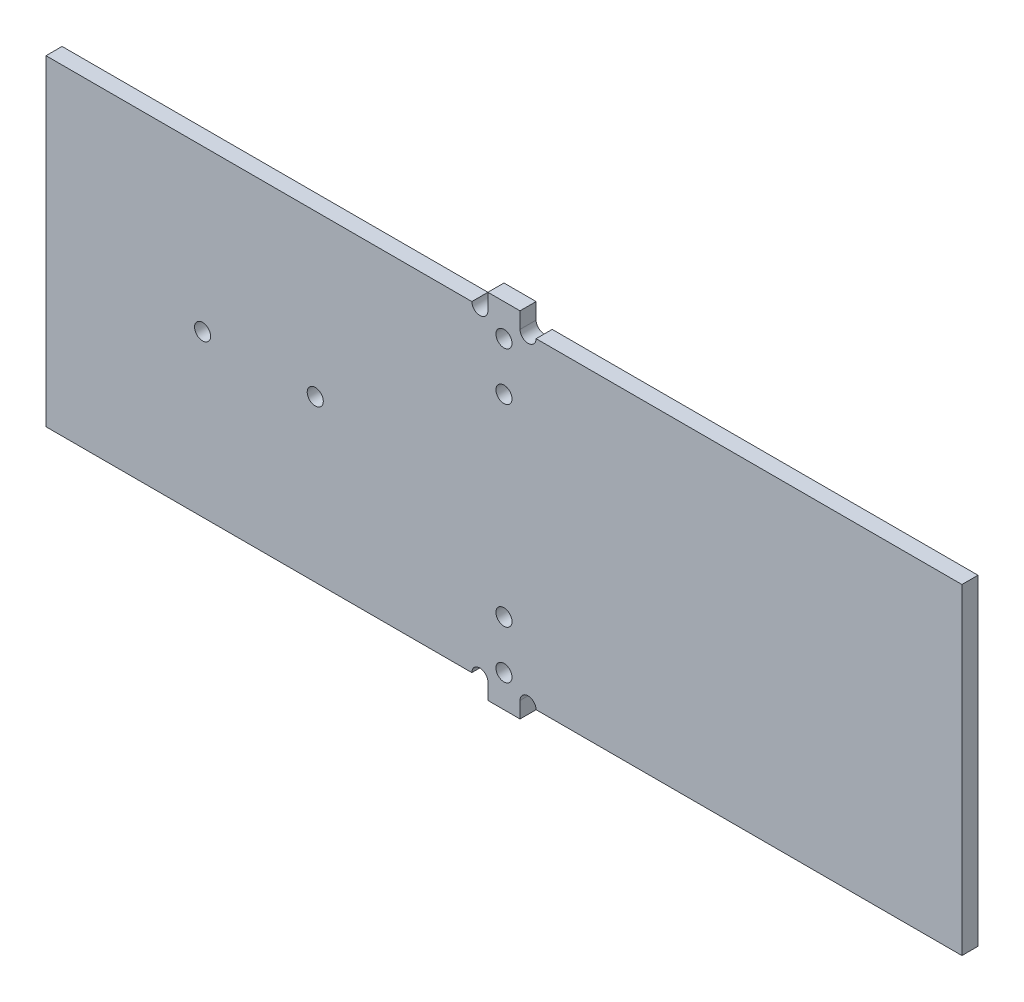
ISO-10303-21;
HEADER;
FILE_DESCRIPTION(('STEP AP214'),'2;1');
FILE_NAME('part.step','',(''),(''),'','','');
FILE_SCHEMA(('AUTOMOTIVE_DESIGN { 1 0 10303 214 1 1 1 1 }'));
ENDSEC;
DATA;
#1=APPLICATION_CONTEXT('core data for automotive mechanical design processes');
#2=APPLICATION_PROTOCOL_DEFINITION('international standard','automotive_design',2000,#1);
#3=PRODUCT_CONTEXT('',#1,'mechanical');
#4=PRODUCT('Part','Part','',(#3));
#5=PRODUCT_RELATED_PRODUCT_CATEGORY('part','',(#4));
#6=PRODUCT_DEFINITION_FORMATION('','',#4);
#7=PRODUCT_DEFINITION_CONTEXT('part definition',#1,'design');
#8=PRODUCT_DEFINITION('design','',#6,#7);
#9=PRODUCT_DEFINITION_SHAPE('','',#8);
#10=(LENGTH_UNIT() NAMED_UNIT(*) SI_UNIT(.MILLI.,.METRE.));
#11=(NAMED_UNIT(*) PLANE_ANGLE_UNIT() SI_UNIT($,.RADIAN.));
#12=(NAMED_UNIT(*) SI_UNIT($,.STERADIAN.) SOLID_ANGLE_UNIT());
#13=UNCERTAINTY_MEASURE_WITH_UNIT(LENGTH_MEASURE(1.E-05),#10,'distance_accuracy_value','');
#14=(GEOMETRIC_REPRESENTATION_CONTEXT(3) GLOBAL_UNCERTAINTY_ASSIGNED_CONTEXT((#13)) GLOBAL_UNIT_ASSIGNED_CONTEXT((#10,
#11,#12)) REPRESENTATION_CONTEXT('',''));
#15=CARTESIAN_POINT('',(0.,0.,0.));
#16=DIRECTION('',(0.,0.,1.));
#17=DIRECTION('',(1.,0.,0.));
#18=AXIS2_PLACEMENT_3D('',#15,#16,#17);
#19=CARTESIAN_POINT('',(-1.66046941871504,31.8943820224719,2.));
#20=DIRECTION('',(0.,0.,-1.));
#21=DIRECTION('',(-1.,0.,0.));
#22=AXIS2_PLACEMENT_3D('',#19,#20,#21);
#23=PLANE('',#22);
#24=CARTESIAN_POINT('',(1.33953058128496,-0.105617977528089,2.));
#25=DIRECTION('',(0.,0.,1.));
#26=DIRECTION('',(1.,0.,0.));
#27=AXIS2_PLACEMENT_3D('',#24,#25,#26);
#28=CIRCLE('',#27,1.);
#29=CARTESIAN_POINT('',(2.33953058128496,-0.105617977528089,2.));
#30=VERTEX_POINT('',#29);
#31=EDGE_CURVE('E564',#30,#30,#28,.T.);
#32=ORIENTED_EDGE('',*,*,#31,.F.);
#33=EDGE_LOOP('',(#32));
#34=FACE_BOUND('',#33,.T.);
#35=CARTESIAN_POINT('',(-36.172114848715,11.8943820224719,2.));
#36=DIRECTION('',(0.,0.,1.));
#37=DIRECTION('',(1.,0.,0.));
#38=AXIS2_PLACEMENT_3D('',#35,#36,#37);
#39=CIRCLE('',#38,0.999999999999998);
#40=CARTESIAN_POINT('',(-35.172114848715,11.8943820224719,2.));
#41=VERTEX_POINT('',#40);
#42=EDGE_CURVE('E570',#41,#41,#39,.T.);
#43=ORIENTED_EDGE('',*,*,#42,.F.);
#44=EDGE_LOOP('',(#43));
#45=FACE_BOUND('',#44,.T.);
#46=CARTESIAN_POINT('',(-22.1488239887151,11.8943820224719,2.));
#47=DIRECTION('',(0.,0.,1.));
#48=DIRECTION('',(1.,0.,0.));
#49=AXIS2_PLACEMENT_3D('',#46,#47,#48);
#50=CIRCLE('',#49,1.);
#51=CARTESIAN_POINT('',(-21.1488239887151,11.8943820224719,2.));
#52=VERTEX_POINT('',#51);
#53=EDGE_CURVE('E578',#52,#52,#50,.T.);
#54=ORIENTED_EDGE('',*,*,#53,.F.);
#55=EDGE_LOOP('',(#54));
#56=FACE_BOUND('',#55,.T.);
#57=CARTESIAN_POINT('',(1.33953058128496,23.8943820224719,2.));
#58=DIRECTION('',(0.,0.,1.));
#59=DIRECTION('',(1.,0.,0.));
#60=AXIS2_PLACEMENT_3D('',#57,#58,#59);
#61=CIRCLE('',#60,1.);
#62=CARTESIAN_POINT('',(2.33953058128496,23.8943820224719,2.));
#63=VERTEX_POINT('',#62);
#64=EDGE_CURVE('E567',#63,#63,#61,.T.);
#65=ORIENTED_EDGE('',*,*,#64,.F.);
#66=EDGE_LOOP('',(#65));
#67=FACE_BOUND('',#66,.T.);
#68=DIRECTION('',(-1.,0.,0.));
#69=VECTOR('',#68,1.);
#70=CARTESIAN_POINT('',(-55.6604694187151,31.8943820224719,2.));
#71=LINE('',#70,#69);
#72=CARTESIAN_POINT('',(-2.66046941871504,31.8943820224719,2.));
#73=VERTEX_POINT('',#72);
#74=CARTESIAN_POINT('',(-55.6604694187151,31.8943820224719,2.));
#75=VERTEX_POINT('',#74);
#76=EDGE_CURVE('E49',#73,#75,#71,.T.);
#77=ORIENTED_EDGE('',*,*,#76,.T.);
#78=DIRECTION('',(0.,-1.,0.));
#79=VECTOR('',#78,1.);
#80=CARTESIAN_POINT('',(-55.6604694187151,30.8943820224719,2.));
#81=LINE('',#80,#79);
#82=CARTESIAN_POINT('',(-55.660469418715,-8.10561797752809,2.));
#83=VERTEX_POINT('',#82);
#84=EDGE_CURVE('E117',#75,#83,#81,.T.);
#85=ORIENTED_EDGE('',*,*,#84,.T.);
#86=DIRECTION('',(1.,0.,0.));
#87=VECTOR('',#86,1.);
#88=CARTESIAN_POINT('',(-55.660469418715,-8.10561797752809,2.));
#89=LINE('',#88,#87);
#90=CARTESIAN_POINT('',(-2.66046941871504,-8.10561797752809,2.));
#91=VERTEX_POINT('',#90);
#92=EDGE_CURVE('E253',#83,#91,#89,.T.);
#93=ORIENTED_EDGE('',*,*,#92,.T.);
#94=CARTESIAN_POINT('',(-1.66046941871504,-8.10561797752809,2.));
#95=DIRECTION('',(0.,0.,-1.));
#96=DIRECTION('',(1.,0.,0.));
#97=AXIS2_PLACEMENT_3D('',#94,#95,#96);
#98=CIRCLE('',#97,1.);
#99=CARTESIAN_POINT('',(-0.660469418715044,-8.10561797752809,2.));
#100=VERTEX_POINT('',#99);
#101=EDGE_CURVE('E268',#91,#100,#98,.T.);
#102=ORIENTED_EDGE('',*,*,#101,.T.);
#103=DIRECTION('',(0.,-1.,0.));
#104=VECTOR('',#103,1.);
#105=CARTESIAN_POINT('',(-0.660469418715044,-8.10561797752809,2.));
#106=LINE('',#105,#104);
#107=CARTESIAN_POINT('',(-0.660469418715044,-10.1056179775281,2.));
#108=VERTEX_POINT('',#107);
#109=EDGE_CURVE('E270',#100,#108,#106,.T.);
#110=ORIENTED_EDGE('',*,*,#109,.T.);
#111=DIRECTION('',(1.,0.,0.));
#112=VECTOR('',#111,1.);
#113=CARTESIAN_POINT('',(-0.660469418715044,-10.1056179775281,2.));
#114=LINE('',#113,#112);
#115=CARTESIAN_POINT('',(3.33953058128496,-10.1056179775281,2.));
#116=VERTEX_POINT('',#115);
#117=EDGE_CURVE('E272',#108,#116,#114,.T.);
#118=ORIENTED_EDGE('',*,*,#117,.T.);
#119=DIRECTION('',(0.,1.,0.));
#120=VECTOR('',#119,1.);
#121=CARTESIAN_POINT('',(3.33953058128496,-8.10561797752809,2.));
#122=LINE('',#121,#120);
#123=CARTESIAN_POINT('',(3.33953058128496,-8.10561797752809,2.));
#124=VERTEX_POINT('',#123);
#125=EDGE_CURVE('E274',#116,#124,#122,.T.);
#126=ORIENTED_EDGE('',*,*,#125,.T.);
#127=CARTESIAN_POINT('',(4.33953058128496,-8.10561797752809,2.));
#128=DIRECTION('',(0.,0.,-1.));
#129=DIRECTION('',(-1.,0.,0.));
#130=AXIS2_PLACEMENT_3D('',#127,#128,#129);
#131=CIRCLE('',#130,1.);
#132=CARTESIAN_POINT('',(5.33953058128496,-8.10561797752809,2.));
#133=VERTEX_POINT('',#132);
#134=EDGE_CURVE('E276',#124,#133,#131,.T.);
#135=ORIENTED_EDGE('',*,*,#134,.T.);
#136=DIRECTION('',(1.,0.,0.));
#137=VECTOR('',#136,1.);
#138=CARTESIAN_POINT('',(5.33953058128496,-8.10561797752809,2.));
#139=LINE('',#138,#137);
#140=CARTESIAN_POINT('',(58.339530581285,-8.10561797752809,2.));
#141=VERTEX_POINT('',#140);
#142=EDGE_CURVE('E278',#133,#141,#139,.T.);
#143=ORIENTED_EDGE('',*,*,#142,.T.);
#144=DIRECTION('',(0.,1.,0.));
#145=VECTOR('',#144,1.);
#146=CARTESIAN_POINT('',(58.339530581285,-7.10561797752808,2.));
#147=LINE('',#146,#145);
#148=CARTESIAN_POINT('',(58.3395305812849,31.8943820224719,2.));
#149=VERTEX_POINT('',#148);
#150=EDGE_CURVE('E280',#141,#149,#147,.T.);
#151=ORIENTED_EDGE('',*,*,#150,.T.);
#152=DIRECTION('',(-1.,0.,0.));
#153=VECTOR('',#152,1.);
#154=CARTESIAN_POINT('',(57.3395305812849,31.8943820224719,2.));
#155=LINE('',#154,#153);
#156=CARTESIAN_POINT('',(5.33953058128496,31.8943820224719,2.));
#157=VERTEX_POINT('',#156);
#158=EDGE_CURVE('E282',#149,#157,#155,.T.);
#159=ORIENTED_EDGE('',*,*,#158,.T.);
#160=CARTESIAN_POINT('',(4.33953058128496,31.8943820224719,2.));
#161=DIRECTION('',(0.,0.,-1.));
#162=DIRECTION('',(1.,0.,0.));
#163=AXIS2_PLACEMENT_3D('',#160,#161,#162);
#164=CIRCLE('',#163,1.);
#165=CARTESIAN_POINT('',(3.33953058128496,31.8943820224719,2.));
#166=VERTEX_POINT('',#165);
#167=EDGE_CURVE('E284',#157,#166,#164,.T.);
#168=ORIENTED_EDGE('',*,*,#167,.T.);
#169=DIRECTION('',(0.,1.,0.));
#170=VECTOR('',#169,1.);
#171=CARTESIAN_POINT('',(3.33953058128496,31.8943820224719,2.));
#172=LINE('',#171,#170);
#173=CARTESIAN_POINT('',(3.33953058128496,33.8943820224719,2.));
#174=VERTEX_POINT('',#173);
#175=EDGE_CURVE('E161',#166,#174,#172,.T.);
#176=ORIENTED_EDGE('',*,*,#175,.T.);
#177=DIRECTION('',(-1.,0.,0.));
#178=VECTOR('',#177,1.);
#179=CARTESIAN_POINT('',(-0.660469418715044,33.8943820224719,2.));
#180=LINE('',#179,#178);
#181=CARTESIAN_POINT('',(-0.660469418715044,33.8943820224719,2.));
#182=VERTEX_POINT('',#181);
#183=EDGE_CURVE('E155',#174,#182,#180,.T.);
#184=ORIENTED_EDGE('',*,*,#183,.T.);
#185=DIRECTION('',(0.,-1.,0.));
#186=VECTOR('',#185,1.);
#187=CARTESIAN_POINT('',(-0.660469418715044,31.8943820224719,2.));
#188=LINE('',#187,#186);
#189=CARTESIAN_POINT('',(-0.660469418715044,31.8943820224719,2.));
#190=VERTEX_POINT('',#189);
#191=EDGE_CURVE('E159',#182,#190,#188,.T.);
#192=ORIENTED_EDGE('',*,*,#191,.T.);
#193=CARTESIAN_POINT('',(-1.66046941871504,31.8943820224719,2.));
#194=DIRECTION('',(0.,0.,-1.));
#195=DIRECTION('',(-1.,0.,0.));
#196=AXIS2_PLACEMENT_3D('',#193,#194,#195);
#197=CIRCLE('',#196,1.);
#198=EDGE_CURVE('E175',#190,#73,#197,.T.);
#199=ORIENTED_EDGE('',*,*,#198,.T.);
#200=EDGE_LOOP('',(#77,#85,#93,#102,#110,#118,#126,#135,#143,#151,#159,#168,#176,#184,#192,#199));
#201=FACE_BOUND('',#200,.T.);
#202=CARTESIAN_POINT('',(1.33953058128496,-6.10561797752809,2.));
#203=DIRECTION('',(0.,0.,1.));
#204=DIRECTION('',(1.,0.,0.));
#205=AXIS2_PLACEMENT_3D('',#202,#203,#204);
#206=CIRCLE('',#205,1.);
#207=CARTESIAN_POINT('',(2.33953058128496,-6.10561797752809,2.));
#208=VERTEX_POINT('',#207);
#209=EDGE_CURVE('E185',#208,#208,#206,.T.);
#210=ORIENTED_EDGE('',*,*,#209,.F.);
#211=EDGE_LOOP('',(#210));
#212=FACE_BOUND('',#211,.T.);
#213=CARTESIAN_POINT('',(1.33953058128496,29.8943820224719,2.));
#214=DIRECTION('',(0.,0.,1.));
#215=DIRECTION('',(1.,0.,0.));
#216=AXIS2_PLACEMENT_3D('',#213,#214,#215);
#217=CIRCLE('',#216,1.);
#218=CARTESIAN_POINT('',(2.33953058128496,29.8943820224719,2.));
#219=VERTEX_POINT('',#218);
#220=EDGE_CURVE('E587',#219,#219,#217,.T.);
#221=ORIENTED_EDGE('',*,*,#220,.F.);
#222=EDGE_LOOP('',(#221));
#223=FACE_BOUND('',#222,.T.);
#224=ADVANCED_FACE('F32',(#34,#45,#56,#67,#201,#212,#223),#23,.F.);
#225=CARTESIAN_POINT('',(-1.66046941871504,31.8943820224719,0.));
#226=DIRECTION('',(0.,0.,-1.));
#227=DIRECTION('',(-1.,0.,0.));
#228=AXIS2_PLACEMENT_3D('',#225,#226,#227);
#229=PLANE('',#228);
#230=CARTESIAN_POINT('',(1.33953058128496,-0.105617977528089,0.));
#231=DIRECTION('',(0.,0.,1.));
#232=DIRECTION('',(1.,0.,0.));
#233=AXIS2_PLACEMENT_3D('',#230,#231,#232);
#234=CIRCLE('',#233,1.);
#235=CARTESIAN_POINT('',(2.33953058128496,-0.105617977528089,0.));
#236=VERTEX_POINT('',#235);
#237=EDGE_CURVE('E562',#236,#236,#234,.T.);
#238=ORIENTED_EDGE('',*,*,#237,.T.);
#239=EDGE_LOOP('',(#238));
#240=FACE_BOUND('',#239,.T.);
#241=CARTESIAN_POINT('',(-36.172114848715,11.8943820224719,0.));
#242=DIRECTION('',(0.,0.,1.));
#243=DIRECTION('',(1.,0.,0.));
#244=AXIS2_PLACEMENT_3D('',#241,#242,#243);
#245=CIRCLE('',#244,0.999999999999998);
#246=CARTESIAN_POINT('',(-35.172114848715,11.8943820224719,0.));
#247=VERTEX_POINT('',#246);
#248=EDGE_CURVE('E565',#247,#247,#245,.T.);
#249=ORIENTED_EDGE('',*,*,#248,.T.);
#250=EDGE_LOOP('',(#249));
#251=FACE_BOUND('',#250,.T.);
#252=CARTESIAN_POINT('',(-22.1488239887151,11.8943820224719,0.));
#253=DIRECTION('',(0.,0.,1.));
#254=DIRECTION('',(1.,0.,0.));
#255=AXIS2_PLACEMENT_3D('',#252,#253,#254);
#256=CIRCLE('',#255,1.);
#257=CARTESIAN_POINT('',(-21.1488239887151,11.8943820224719,0.));
#258=VERTEX_POINT('',#257);
#259=EDGE_CURVE('E575',#258,#258,#256,.T.);
#260=ORIENTED_EDGE('',*,*,#259,.T.);
#261=EDGE_LOOP('',(#260));
#262=FACE_BOUND('',#261,.T.);
#263=CARTESIAN_POINT('',(1.33953058128496,23.8943820224719,0.));
#264=DIRECTION('',(0.,0.,1.));
#265=DIRECTION('',(1.,0.,0.));
#266=AXIS2_PLACEMENT_3D('',#263,#264,#265);
#267=CIRCLE('',#266,1.);
#268=CARTESIAN_POINT('',(2.33953058128496,23.8943820224719,0.));
#269=VERTEX_POINT('',#268);
#270=EDGE_CURVE('E581',#269,#269,#267,.T.);
#271=ORIENTED_EDGE('',*,*,#270,.T.);
#272=EDGE_LOOP('',(#271));
#273=FACE_BOUND('',#272,.T.);
#274=CARTESIAN_POINT('',(1.33953058128496,-6.10561797752809,0.));
#275=DIRECTION('',(0.,0.,1.));
#276=DIRECTION('',(1.,0.,0.));
#277=AXIS2_PLACEMENT_3D('',#274,#275,#276);
#278=CIRCLE('',#277,1.);
#279=CARTESIAN_POINT('',(2.33953058128496,-6.10561797752809,0.));
#280=VERTEX_POINT('',#279);
#281=EDGE_CURVE('E264',#280,#280,#278,.T.);
#282=ORIENTED_EDGE('',*,*,#281,.T.);
#283=EDGE_LOOP('',(#282));
#284=FACE_BOUND('',#283,.T.);
#285=DIRECTION('',(0.,-1.,0.));
#286=VECTOR('',#285,1.);
#287=CARTESIAN_POINT('',(-55.660469418715,-7.10561797752808,0.));
#288=LINE('',#287,#286);
#289=CARTESIAN_POINT('',(-55.6604694187151,31.8943820224719,0.));
#290=VERTEX_POINT('',#289);
#291=CARTESIAN_POINT('',(-55.660469418715,-8.10561797752809,0.));
#292=VERTEX_POINT('',#291);
#293=EDGE_CURVE('E181',#290,#292,#288,.T.);
#294=ORIENTED_EDGE('',*,*,#293,.F.);
#295=DIRECTION('',(-1.,0.,0.));
#296=VECTOR('',#295,1.);
#297=CARTESIAN_POINT('',(-54.660469418715,31.8943820224719,0.));
#298=LINE('',#297,#296);
#299=CARTESIAN_POINT('',(-2.66046941871504,31.8943820224719,0.));
#300=VERTEX_POINT('',#299);
#301=EDGE_CURVE('E213',#300,#290,#298,.T.);
#302=ORIENTED_EDGE('',*,*,#301,.F.);
#303=CARTESIAN_POINT('',(-1.66046941871504,31.8943820224719,0.));
#304=DIRECTION('',(0.,0.,-1.));
#305=DIRECTION('',(-1.,0.,0.));
#306=AXIS2_PLACEMENT_3D('',#303,#304,#305);
#307=CIRCLE('',#306,1.);
#308=CARTESIAN_POINT('',(-0.660469418715044,31.8943820224719,0.));
#309=VERTEX_POINT('',#308);
#310=EDGE_CURVE('E110',#309,#300,#307,.T.);
#311=ORIENTED_EDGE('',*,*,#310,.F.);
#312=DIRECTION('',(0.,-1.,0.));
#313=VECTOR('',#312,1.);
#314=CARTESIAN_POINT('',(-0.660469418715044,31.8943820224719,0.));
#315=LINE('',#314,#313);
#316=CARTESIAN_POINT('',(-0.660469418715044,33.8943820224719,0.));
#317=VERTEX_POINT('',#316);
#318=EDGE_CURVE('E103',#317,#309,#315,.T.);
#319=ORIENTED_EDGE('',*,*,#318,.F.);
#320=DIRECTION('',(-1.,0.,0.));
#321=VECTOR('',#320,1.);
#322=CARTESIAN_POINT('',(-0.660469418715044,33.8943820224719,0.));
#323=LINE('',#322,#321);
#324=CARTESIAN_POINT('',(3.33953058128496,33.8943820224719,0.));
#325=VERTEX_POINT('',#324);
#326=EDGE_CURVE('E169',#325,#317,#323,.T.);
#327=ORIENTED_EDGE('',*,*,#326,.F.);
#328=DIRECTION('',(0.,1.,0.));
#329=VECTOR('',#328,1.);
#330=CARTESIAN_POINT('',(3.33953058128496,31.8943820224719,0.));
#331=LINE('',#330,#329);
#332=CARTESIAN_POINT('',(3.33953058128496,31.8943820224719,0.));
#333=VERTEX_POINT('',#332);
#334=EDGE_CURVE('E208',#333,#325,#331,.T.);
#335=ORIENTED_EDGE('',*,*,#334,.F.);
#336=CARTESIAN_POINT('',(4.33953058128496,31.8943820224719,0.));
#337=DIRECTION('',(0.,0.,-1.));
#338=DIRECTION('',(1.,0.,0.));
#339=AXIS2_PLACEMENT_3D('',#336,#337,#338);
#340=CIRCLE('',#339,1.);
#341=CARTESIAN_POINT('',(5.33953058128496,31.8943820224719,0.));
#342=VERTEX_POINT('',#341);
#343=EDGE_CURVE('E206',#342,#333,#340,.T.);
#344=ORIENTED_EDGE('',*,*,#343,.F.);
#345=DIRECTION('',(-1.,0.,0.));
#346=VECTOR('',#345,1.);
#347=CARTESIAN_POINT('',(5.33953058128496,31.8943820224719,0.));
#348=LINE('',#347,#346);
#349=CARTESIAN_POINT('',(58.3395305812849,31.8943820224719,0.));
#350=VERTEX_POINT('',#349);
#351=EDGE_CURVE('E204',#350,#342,#348,.T.);
#352=ORIENTED_EDGE('',*,*,#351,.F.);
#353=DIRECTION('',(0.,1.,0.));
#354=VECTOR('',#353,1.);
#355=CARTESIAN_POINT('',(58.3395305812849,31.8943820224719,0.));
#356=LINE('',#355,#354);
#357=CARTESIAN_POINT('',(58.339530581285,-8.10561797752809,0.));
#358=VERTEX_POINT('',#357);
#359=EDGE_CURVE('E201',#358,#350,#356,.T.);
#360=ORIENTED_EDGE('',*,*,#359,.F.);
#361=DIRECTION('',(1.,0.,0.));
#362=VECTOR('',#361,1.);
#363=CARTESIAN_POINT('',(58.339530581285,-8.10561797752809,0.));
#364=LINE('',#363,#362);
#365=CARTESIAN_POINT('',(5.33953058128496,-8.10561797752809,0.));
#366=VERTEX_POINT('',#365);
#367=EDGE_CURVE('E198',#366,#358,#364,.T.);
#368=ORIENTED_EDGE('',*,*,#367,.F.);
#369=CARTESIAN_POINT('',(4.33953058128496,-8.10561797752809,0.));
#370=DIRECTION('',(0.,0.,-1.));
#371=DIRECTION('',(-1.,0.,0.));
#372=AXIS2_PLACEMENT_3D('',#369,#370,#371);
#373=CIRCLE('',#372,1.);
#374=CARTESIAN_POINT('',(3.33953058128496,-8.10561797752809,0.));
#375=VERTEX_POINT('',#374);
#376=EDGE_CURVE('E195',#375,#366,#373,.T.);
#377=ORIENTED_EDGE('',*,*,#376,.F.);
#378=DIRECTION('',(0.,1.,0.));
#379=VECTOR('',#378,1.);
#380=CARTESIAN_POINT('',(3.33953058128496,-8.10561797752809,0.));
#381=LINE('',#380,#379);
#382=CARTESIAN_POINT('',(3.33953058128496,-10.1056179775281,0.));
#383=VERTEX_POINT('',#382);
#384=EDGE_CURVE('E193',#383,#375,#381,.T.);
#385=ORIENTED_EDGE('',*,*,#384,.F.);
#386=DIRECTION('',(1.,0.,0.));
#387=VECTOR('',#386,1.);
#388=CARTESIAN_POINT('',(-0.660469418715044,-10.1056179775281,0.));
#389=LINE('',#388,#387);
#390=CARTESIAN_POINT('',(-0.660469418715044,-10.1056179775281,0.));
#391=VERTEX_POINT('',#390);
#392=EDGE_CURVE('E191',#391,#383,#389,.T.);
#393=ORIENTED_EDGE('',*,*,#392,.F.);
#394=DIRECTION('',(0.,-1.,0.));
#395=VECTOR('',#394,1.);
#396=CARTESIAN_POINT('',(-0.660469418715044,-8.10561797752809,0.));
#397=LINE('',#396,#395);
#398=CARTESIAN_POINT('',(-0.660469418715044,-8.10561797752809,0.));
#399=VERTEX_POINT('',#398);
#400=EDGE_CURVE('E189',#399,#391,#397,.T.);
#401=ORIENTED_EDGE('',*,*,#400,.F.);
#402=CARTESIAN_POINT('',(-1.66046941871504,-8.10561797752809,0.));
#403=DIRECTION('',(0.,0.,-1.));
#404=DIRECTION('',(1.,0.,0.));
#405=AXIS2_PLACEMENT_3D('',#402,#403,#404);
#406=CIRCLE('',#405,1.);
#407=CARTESIAN_POINT('',(-2.66046941871504,-8.10561797752809,0.));
#408=VERTEX_POINT('',#407);
#409=EDGE_CURVE('E187',#408,#399,#406,.T.);
#410=ORIENTED_EDGE('',*,*,#409,.F.);
#411=DIRECTION('',(1.,0.,0.));
#412=VECTOR('',#411,1.);
#413=CARTESIAN_POINT('',(-54.660469418715,-8.10561797752809,0.));
#414=LINE('',#413,#412);
#415=EDGE_CURVE('E184',#292,#408,#414,.T.);
#416=ORIENTED_EDGE('',*,*,#415,.F.);
#417=EDGE_LOOP('',(#294,#302,#311,#319,#327,#335,#344,#352,#360,#368,#377,#385,#393,#401,#410,#416));
#418=FACE_BOUND('',#417,.T.);
#419=CARTESIAN_POINT('',(1.33953058128496,29.8943820224719,0.));
#420=DIRECTION('',(0.,0.,1.));
#421=DIRECTION('',(1.,0.,0.));
#422=AXIS2_PLACEMENT_3D('',#419,#420,#421);
#423=CIRCLE('',#422,1.);
#424=CARTESIAN_POINT('',(2.33953058128496,29.8943820224719,0.));
#425=VERTEX_POINT('',#424);
#426=EDGE_CURVE('E584',#425,#425,#423,.T.);
#427=ORIENTED_EDGE('',*,*,#426,.T.);
#428=EDGE_LOOP('',(#427));
#429=FACE_BOUND('',#428,.T.);
#430=ADVANCED_FACE('F256',(#240,#251,#262,#273,#284,#418,#429),#229,.T.);
#431=CARTESIAN_POINT('',(-55.660469418715,-7.10561797752808,2.));
#432=DIRECTION('',(1.,0.,0.));
#433=DIRECTION('',(0.,0.,-1.));
#434=AXIS2_PLACEMENT_3D('',#431,#432,#433);
#435=PLANE('',#434);
#436=ORIENTED_EDGE('',*,*,#293,.T.);
#437=DIRECTION('',(0.,0.,-1.));
#438=VECTOR('',#437,1.);
#439=CARTESIAN_POINT('',(-55.660469418715,-8.10561797752809,2.));
#440=LINE('',#439,#438);
#441=EDGE_CURVE('E41',#83,#292,#440,.T.);
#442=ORIENTED_EDGE('',*,*,#441,.F.);
#443=ORIENTED_EDGE('',*,*,#84,.F.);
#444=DIRECTION('',(0.,0.,-1.));
#445=VECTOR('',#444,1.);
#446=CARTESIAN_POINT('',(-55.6604694187151,31.8943820224719,2.));
#447=LINE('',#446,#445);
#448=EDGE_CURVE('E11',#75,#290,#447,.T.);
#449=ORIENTED_EDGE('',*,*,#448,.T.);
#450=EDGE_LOOP('',(#436,#442,#443,#449));
#451=FACE_BOUND('',#450,.T.);
#452=ADVANCED_FACE('F34',(#451),#435,.F.);
#453=CARTESIAN_POINT('',(-54.660469418715,-8.10561797752809,2.));
#454=DIRECTION('',(0.,1.,0.));
#455=DIRECTION('',(0.,0.,1.));
#456=AXIS2_PLACEMENT_3D('',#453,#454,#455);
#457=PLANE('',#456);
#458=ORIENTED_EDGE('',*,*,#415,.T.);
#459=DIRECTION('',(0.,0.,-1.));
#460=VECTOR('',#459,1.);
#461=CARTESIAN_POINT('',(-2.66046941871504,-8.10561797752809,2.));
#462=LINE('',#461,#460);
#463=EDGE_CURVE('E246',#91,#408,#462,.T.);
#464=ORIENTED_EDGE('',*,*,#463,.F.);
#465=ORIENTED_EDGE('',*,*,#92,.F.);
#466=ORIENTED_EDGE('',*,*,#441,.T.);
#467=EDGE_LOOP('',(#458,#464,#465,#466));
#468=FACE_BOUND('',#467,.T.);
#469=ADVANCED_FACE('F251',(#468),#457,.F.);
#470=CARTESIAN_POINT('',(-1.66046941871504,-8.10561797752809,2.));
#471=DIRECTION('',(0.,0.,-1.));
#472=DIRECTION('',(-1.,0.,0.));
#473=AXIS2_PLACEMENT_3D('',#470,#471,#472);
#474=CYLINDRICAL_SURFACE('',#473,1.);
#475=ORIENTED_EDGE('',*,*,#409,.T.);
#476=DIRECTION('',(0.,0.,-1.));
#477=VECTOR('',#476,1.);
#478=CARTESIAN_POINT('',(-0.660469418715044,-8.10561797752809,2.));
#479=LINE('',#478,#477);
#480=EDGE_CURVE('E243',#100,#399,#479,.T.);
#481=ORIENTED_EDGE('',*,*,#480,.F.);
#482=ORIENTED_EDGE('',*,*,#101,.F.);
#483=ORIENTED_EDGE('',*,*,#463,.T.);
#484=EDGE_LOOP('',(#475,#481,#482,#483));
#485=FACE_BOUND('',#484,.T.);
#486=ADVANCED_FACE('F492',(#485),#474,.F.);
#487=CARTESIAN_POINT('',(-0.660469418715044,-8.10561797752809,2.));
#488=DIRECTION('',(1.,0.,0.));
#489=DIRECTION('',(0.,0.,-1.));
#490=AXIS2_PLACEMENT_3D('',#487,#488,#489);
#491=PLANE('',#490);
#492=ORIENTED_EDGE('',*,*,#400,.T.);
#493=DIRECTION('',(0.,0.,-1.));
#494=VECTOR('',#493,1.);
#495=CARTESIAN_POINT('',(-0.660469418715044,-10.1056179775281,2.));
#496=LINE('',#495,#494);
#497=EDGE_CURVE('E240',#108,#391,#496,.T.);
#498=ORIENTED_EDGE('',*,*,#497,.F.);
#499=ORIENTED_EDGE('',*,*,#109,.F.);
#500=ORIENTED_EDGE('',*,*,#480,.T.);
#501=EDGE_LOOP('',(#492,#498,#499,#500));
#502=FACE_BOUND('',#501,.T.);
#503=ADVANCED_FACE('F482',(#502),#491,.F.);
#504=CARTESIAN_POINT('',(-0.660469418715044,-10.1056179775281,2.));
#505=DIRECTION('',(0.,1.,0.));
#506=DIRECTION('',(0.,0.,1.));
#507=AXIS2_PLACEMENT_3D('',#504,#505,#506);
#508=PLANE('',#507);
#509=ORIENTED_EDGE('',*,*,#392,.T.);
#510=DIRECTION('',(0.,0.,-1.));
#511=VECTOR('',#510,1.);
#512=CARTESIAN_POINT('',(3.33953058128496,-10.1056179775281,2.));
#513=LINE('',#512,#511);
#514=EDGE_CURVE('E237',#116,#383,#513,.T.);
#515=ORIENTED_EDGE('',*,*,#514,.F.);
#516=ORIENTED_EDGE('',*,*,#117,.F.);
#517=ORIENTED_EDGE('',*,*,#497,.T.);
#518=EDGE_LOOP('',(#509,#515,#516,#517));
#519=FACE_BOUND('',#518,.T.);
#520=ADVANCED_FACE('F472',(#519),#508,.F.);
#521=CARTESIAN_POINT('',(3.33953058128496,-8.10561797752809,2.));
#522=DIRECTION('',(-1.,0.,0.));
#523=DIRECTION('',(0.,0.,1.));
#524=AXIS2_PLACEMENT_3D('',#521,#522,#523);
#525=PLANE('',#524);
#526=ORIENTED_EDGE('',*,*,#384,.T.);
#527=DIRECTION('',(0.,0.,-1.));
#528=VECTOR('',#527,1.);
#529=CARTESIAN_POINT('',(3.33953058128496,-8.10561797752809,2.));
#530=LINE('',#529,#528);
#531=EDGE_CURVE('E234',#124,#375,#530,.T.);
#532=ORIENTED_EDGE('',*,*,#531,.F.);
#533=ORIENTED_EDGE('',*,*,#125,.F.);
#534=ORIENTED_EDGE('',*,*,#514,.T.);
#535=EDGE_LOOP('',(#526,#532,#533,#534));
#536=FACE_BOUND('',#535,.T.);
#537=ADVANCED_FACE('F462',(#536),#525,.F.);
#538=CARTESIAN_POINT('',(4.33953058128496,-8.10561797752809,2.));
#539=DIRECTION('',(0.,0.,-1.));
#540=DIRECTION('',(-1.,0.,0.));
#541=AXIS2_PLACEMENT_3D('',#538,#539,#540);
#542=CYLINDRICAL_SURFACE('',#541,1.);
#543=ORIENTED_EDGE('',*,*,#376,.T.);
#544=DIRECTION('',(0.,0.,-1.));
#545=VECTOR('',#544,1.);
#546=CARTESIAN_POINT('',(5.33953058128496,-8.10561797752809,2.));
#547=LINE('',#546,#545);
#548=EDGE_CURVE('E231',#133,#366,#547,.T.);
#549=ORIENTED_EDGE('',*,*,#548,.F.);
#550=ORIENTED_EDGE('',*,*,#134,.F.);
#551=ORIENTED_EDGE('',*,*,#531,.T.);
#552=EDGE_LOOP('',(#543,#549,#550,#551));
#553=FACE_BOUND('',#552,.T.);
#554=ADVANCED_FACE('F450',(#553),#542,.F.);
#555=CARTESIAN_POINT('',(58.339530581285,-8.10561797752809,2.));
#556=DIRECTION('',(0.,1.,0.));
#557=DIRECTION('',(0.,0.,1.));
#558=AXIS2_PLACEMENT_3D('',#555,#556,#557);
#559=PLANE('',#558);
#560=ORIENTED_EDGE('',*,*,#367,.T.);
#561=DIRECTION('',(0.,0.,-1.));
#562=VECTOR('',#561,1.);
#563=CARTESIAN_POINT('',(58.339530581285,-8.10561797752809,2.));
#564=LINE('',#563,#562);
#565=EDGE_CURVE('E228',#141,#358,#564,.T.);
#566=ORIENTED_EDGE('',*,*,#565,.F.);
#567=ORIENTED_EDGE('',*,*,#142,.F.);
#568=ORIENTED_EDGE('',*,*,#548,.T.);
#569=EDGE_LOOP('',(#560,#566,#567,#568));
#570=FACE_BOUND('',#569,.T.);
#571=ADVANCED_FACE('F309',(#570),#559,.F.);
#572=CARTESIAN_POINT('',(58.3395305812849,31.8943820224719,2.));
#573=DIRECTION('',(-1.,0.,0.));
#574=DIRECTION('',(0.,0.,1.));
#575=AXIS2_PLACEMENT_3D('',#572,#573,#574);
#576=PLANE('',#575);
#577=ORIENTED_EDGE('',*,*,#359,.T.);
#578=DIRECTION('',(0.,0.,-1.));
#579=VECTOR('',#578,1.);
#580=CARTESIAN_POINT('',(58.3395305812849,31.8943820224719,2.));
#581=LINE('',#580,#579);
#582=EDGE_CURVE('E225',#149,#350,#581,.T.);
#583=ORIENTED_EDGE('',*,*,#582,.F.);
#584=ORIENTED_EDGE('',*,*,#150,.F.);
#585=ORIENTED_EDGE('',*,*,#565,.T.);
#586=EDGE_LOOP('',(#577,#583,#584,#585));
#587=FACE_BOUND('',#586,.T.);
#588=ADVANCED_FACE('F298',(#587),#576,.F.);
#589=CARTESIAN_POINT('',(5.33953058128496,31.8943820224719,2.));
#590=DIRECTION('',(0.,-1.,0.));
#591=DIRECTION('',(0.,0.,-1.));
#592=AXIS2_PLACEMENT_3D('',#589,#590,#591);
#593=PLANE('',#592);
#594=ORIENTED_EDGE('',*,*,#351,.T.);
#595=DIRECTION('',(0.,0.,-1.));
#596=VECTOR('',#595,1.);
#597=CARTESIAN_POINT('',(5.33953058128496,31.8943820224719,2.));
#598=LINE('',#597,#596);
#599=EDGE_CURVE('E222',#157,#342,#598,.T.);
#600=ORIENTED_EDGE('',*,*,#599,.F.);
#601=ORIENTED_EDGE('',*,*,#158,.F.);
#602=ORIENTED_EDGE('',*,*,#582,.T.);
#603=EDGE_LOOP('',(#594,#600,#601,#602));
#604=FACE_BOUND('',#603,.T.);
#605=ADVANCED_FACE('F301',(#604),#593,.F.);
#606=CARTESIAN_POINT('',(4.33953058128496,31.8943820224719,2.));
#607=DIRECTION('',(0.,0.,-1.));
#608=DIRECTION('',(-1.,0.,0.));
#609=AXIS2_PLACEMENT_3D('',#606,#607,#608);
#610=CYLINDRICAL_SURFACE('',#609,1.);
#611=ORIENTED_EDGE('',*,*,#343,.T.);
#612=DIRECTION('',(0.,0.,-1.));
#613=VECTOR('',#612,1.);
#614=CARTESIAN_POINT('',(3.33953058128496,31.8943820224719,2.));
#615=LINE('',#614,#613);
#616=EDGE_CURVE('E219',#166,#333,#615,.T.);
#617=ORIENTED_EDGE('',*,*,#616,.F.);
#618=ORIENTED_EDGE('',*,*,#167,.F.);
#619=ORIENTED_EDGE('',*,*,#599,.T.);
#620=EDGE_LOOP('',(#611,#617,#618,#619));
#621=FACE_BOUND('',#620,.T.);
#622=ADVANCED_FACE('F290',(#621),#610,.F.);
#623=CARTESIAN_POINT('',(3.33953058128496,31.8943820224719,2.));
#624=DIRECTION('',(-1.,0.,0.));
#625=DIRECTION('',(0.,0.,1.));
#626=AXIS2_PLACEMENT_3D('',#623,#624,#625);
#627=PLANE('',#626);
#628=ORIENTED_EDGE('',*,*,#334,.T.);
#629=DIRECTION('',(0.,0.,-1.));
#630=VECTOR('',#629,1.);
#631=CARTESIAN_POINT('',(3.33953058128496,33.8943820224719,2.));
#632=LINE('',#631,#630);
#633=EDGE_CURVE('E170',#174,#325,#632,.T.);
#634=ORIENTED_EDGE('',*,*,#633,.F.);
#635=ORIENTED_EDGE('',*,*,#175,.F.);
#636=ORIENTED_EDGE('',*,*,#616,.T.);
#637=EDGE_LOOP('',(#628,#634,#635,#636));
#638=FACE_BOUND('',#637,.T.);
#639=ADVANCED_FACE('F294',(#638),#627,.F.);
#640=CARTESIAN_POINT('',(-0.660469418715044,33.8943820224719,2.));
#641=DIRECTION('',(0.,-1.,0.));
#642=DIRECTION('',(0.,0.,-1.));
#643=AXIS2_PLACEMENT_3D('',#640,#641,#642);
#644=PLANE('',#643);
#645=ORIENTED_EDGE('',*,*,#326,.T.);
#646=DIRECTION('',(0.,0.,-1.));
#647=VECTOR('',#646,1.);
#648=CARTESIAN_POINT('',(-0.660469418715044,33.8943820224719,2.));
#649=LINE('',#648,#647);
#650=EDGE_CURVE('E166',#182,#317,#649,.T.);
#651=ORIENTED_EDGE('',*,*,#650,.F.);
#652=ORIENTED_EDGE('',*,*,#183,.F.);
#653=ORIENTED_EDGE('',*,*,#633,.T.);
#654=EDGE_LOOP('',(#645,#651,#652,#653));
#655=FACE_BOUND('',#654,.T.);
#656=ADVANCED_FACE('F167',(#655),#644,.F.);
#657=CARTESIAN_POINT('',(-0.660469418715044,31.8943820224719,2.));
#658=DIRECTION('',(1.,0.,0.));
#659=DIRECTION('',(0.,0.,-1.));
#660=AXIS2_PLACEMENT_3D('',#657,#658,#659);
#661=PLANE('',#660);
#662=ORIENTED_EDGE('',*,*,#318,.T.);
#663=DIRECTION('',(0.,0.,-1.));
#664=VECTOR('',#663,1.);
#665=CARTESIAN_POINT('',(-0.660469418715044,31.8943820224719,2.));
#666=LINE('',#665,#664);
#667=EDGE_CURVE('E171',#190,#309,#666,.T.);
#668=ORIENTED_EDGE('',*,*,#667,.F.);
#669=ORIENTED_EDGE('',*,*,#191,.F.);
#670=ORIENTED_EDGE('',*,*,#650,.T.);
#671=EDGE_LOOP('',(#662,#668,#669,#670));
#672=FACE_BOUND('',#671,.T.);
#673=ADVANCED_FACE('F173',(#672),#661,.F.);
#674=CARTESIAN_POINT('',(-1.66046941871504,31.8943820224719,2.));
#675=DIRECTION('',(0.,0.,-1.));
#676=DIRECTION('',(-1.,0.,0.));
#677=AXIS2_PLACEMENT_3D('',#674,#675,#676);
#678=CYLINDRICAL_SURFACE('',#677,1.);
#679=ORIENTED_EDGE('',*,*,#310,.T.);
#680=DIRECTION('',(0.,0.,-1.));
#681=VECTOR('',#680,1.);
#682=CARTESIAN_POINT('',(-2.66046941871504,31.8943820224719,2.));
#683=LINE('',#682,#681);
#684=EDGE_CURVE('E177',#73,#300,#683,.T.);
#685=ORIENTED_EDGE('',*,*,#684,.F.);
#686=ORIENTED_EDGE('',*,*,#198,.F.);
#687=ORIENTED_EDGE('',*,*,#667,.T.);
#688=EDGE_LOOP('',(#679,#685,#686,#687));
#689=FACE_BOUND('',#688,.T.);
#690=ADVANCED_FACE('F260',(#689),#678,.F.);
#691=CARTESIAN_POINT('',(-54.660469418715,31.8943820224719,2.));
#692=DIRECTION('',(0.,-1.,0.));
#693=DIRECTION('',(0.,0.,-1.));
#694=AXIS2_PLACEMENT_3D('',#691,#692,#693);
#695=PLANE('',#694);
#696=ORIENTED_EDGE('',*,*,#301,.T.);
#697=ORIENTED_EDGE('',*,*,#448,.F.);
#698=ORIENTED_EDGE('',*,*,#76,.F.);
#699=ORIENTED_EDGE('',*,*,#684,.T.);
#700=EDGE_LOOP('',(#696,#697,#698,#699));
#701=FACE_BOUND('',#700,.T.);
#702=ADVANCED_FACE('F259',(#701),#695,.F.);
#703=CARTESIAN_POINT('',(1.33953058128496,-6.10561797752809,2.));
#704=DIRECTION('',(0.,0.,-1.));
#705=DIRECTION('',(-1.,0.,0.));
#706=AXIS2_PLACEMENT_3D('',#703,#704,#705);
#707=CYLINDRICAL_SURFACE('',#706,1.);
#708=ORIENTED_EDGE('',*,*,#209,.T.);
#709=EDGE_LOOP('',(#708));
#710=FACE_BOUND('',#709,.T.);
#711=ORIENTED_EDGE('',*,*,#281,.F.);
#712=EDGE_LOOP('',(#711));
#713=FACE_BOUND('',#712,.T.);
#714=ADVANCED_FACE('F322',(#710,#713),#707,.F.);
#715=CARTESIAN_POINT('',(1.33953058128496,29.8943820224719,2.));
#716=DIRECTION('',(0.,0.,-1.));
#717=DIRECTION('',(-1.,0.,0.));
#718=AXIS2_PLACEMENT_3D('',#715,#716,#717);
#719=CYLINDRICAL_SURFACE('',#718,1.);
#720=ORIENTED_EDGE('',*,*,#220,.T.);
#721=EDGE_LOOP('',(#720));
#722=FACE_BOUND('',#721,.T.);
#723=ORIENTED_EDGE('',*,*,#426,.F.);
#724=EDGE_LOOP('',(#723));
#725=FACE_BOUND('',#724,.T.);
#726=ADVANCED_FACE('F360',(#722,#725),#719,.F.);
#727=CARTESIAN_POINT('',(1.33953058128496,23.8943820224719,0.));
#728=DIRECTION('',(0.,0.,1.));
#729=DIRECTION('',(1.,0.,0.));
#730=AXIS2_PLACEMENT_3D('',#727,#728,#729);
#731=CYLINDRICAL_SURFACE('',#730,1.);
#732=ORIENTED_EDGE('',*,*,#270,.F.);
#733=EDGE_LOOP('',(#732));
#734=FACE_BOUND('',#733,.T.);
#735=ORIENTED_EDGE('',*,*,#64,.T.);
#736=EDGE_LOOP('',(#735));
#737=FACE_BOUND('',#736,.T.);
#738=ADVANCED_FACE('F367',(#734,#737),#731,.F.);
#739=CARTESIAN_POINT('',(-22.1488239887151,11.8943820224719,0.));
#740=DIRECTION('',(0.,0.,1.));
#741=DIRECTION('',(1.,0.,0.));
#742=AXIS2_PLACEMENT_3D('',#739,#740,#741);
#743=CYLINDRICAL_SURFACE('',#742,1.);
#744=ORIENTED_EDGE('',*,*,#259,.F.);
#745=EDGE_LOOP('',(#744));
#746=FACE_BOUND('',#745,.T.);
#747=ORIENTED_EDGE('',*,*,#53,.T.);
#748=EDGE_LOOP('',(#747));
#749=FACE_BOUND('',#748,.T.);
#750=ADVANCED_FACE('F374',(#746,#749),#743,.F.);
#751=CARTESIAN_POINT('',(-36.172114848715,11.8943820224719,0.));
#752=DIRECTION('',(0.,0.,1.));
#753=DIRECTION('',(1.,0.,0.));
#754=AXIS2_PLACEMENT_3D('',#751,#752,#753);
#755=CYLINDRICAL_SURFACE('',#754,0.999999999999998);
#756=ORIENTED_EDGE('',*,*,#248,.F.);
#757=EDGE_LOOP('',(#756));
#758=FACE_BOUND('',#757,.T.);
#759=ORIENTED_EDGE('',*,*,#42,.T.);
#760=EDGE_LOOP('',(#759));
#761=FACE_BOUND('',#760,.T.);
#762=ADVANCED_FACE('F383',(#758,#761),#755,.F.);
#763=CARTESIAN_POINT('',(1.33953058128496,-0.105617977528089,0.));
#764=DIRECTION('',(0.,0.,1.));
#765=DIRECTION('',(1.,0.,0.));
#766=AXIS2_PLACEMENT_3D('',#763,#764,#765);
#767=CYLINDRICAL_SURFACE('',#766,1.);
#768=ORIENTED_EDGE('',*,*,#237,.F.);
#769=EDGE_LOOP('',(#768));
#770=FACE_BOUND('',#769,.T.);
#771=ORIENTED_EDGE('',*,*,#31,.T.);
#772=EDGE_LOOP('',(#771));
#773=FACE_BOUND('',#772,.T.);
#774=ADVANCED_FACE('F391',(#770,#773),#767,.F.);
#775=CLOSED_SHELL('',(#224,#430,#452,#469,#486,#503,#520,#537,#554,#571,#588,#605,#622,#639,
#656,#673,#690,#702,#714,#726,#738,#750,#762,#774));
#776=MANIFOLD_SOLID_BREP('B2',#775);
#777=ADVANCED_BREP_SHAPE_REPRESENTATION('',(#18,#776),#14);
#778=SHAPE_DEFINITION_REPRESENTATION(#9,#777);
ENDSEC;
END-ISO-10303-21;
